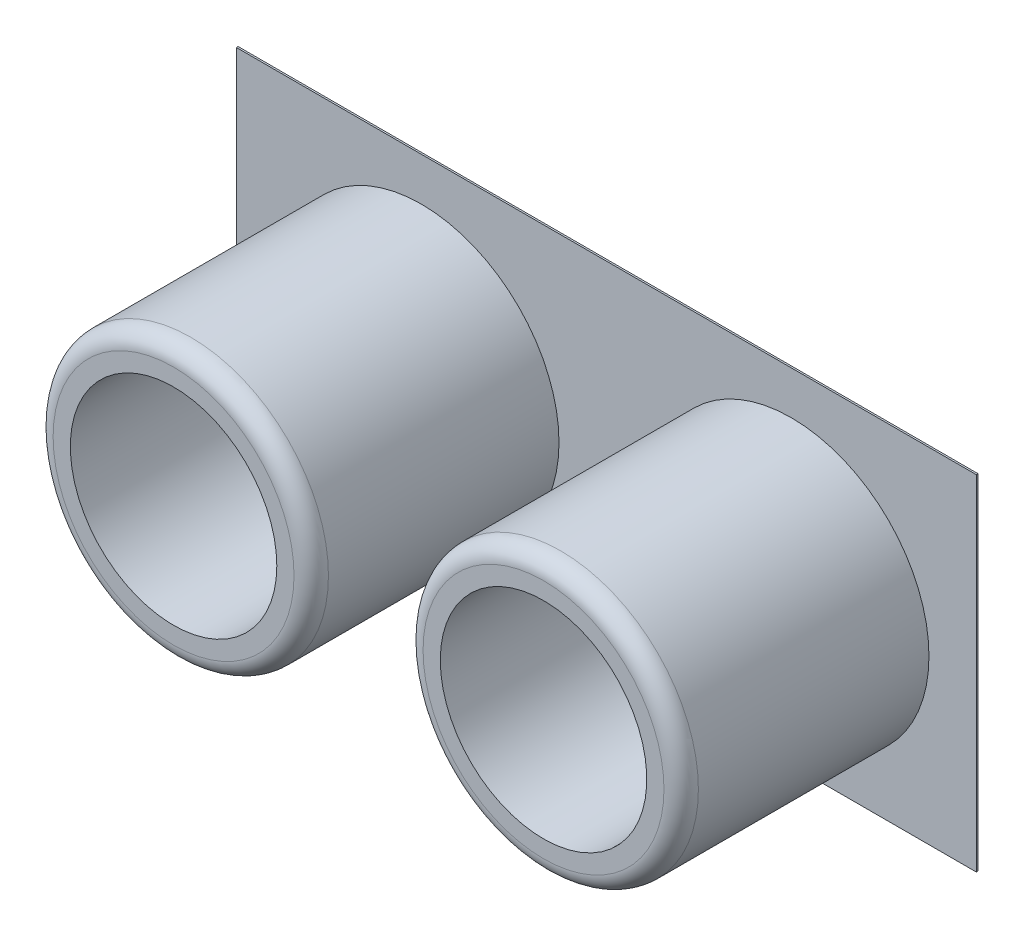
ISO-10303-21;
HEADER;
FILE_DESCRIPTION(('STEP AP214'),'2;1');
FILE_NAME('part.step','',(''),(''),'','','');
FILE_SCHEMA(('AUTOMOTIVE_DESIGN { 1 0 10303 214 1 1 1 1 }'));
ENDSEC;
DATA;
#1=APPLICATION_CONTEXT('core data for automotive mechanical design processes');
#2=APPLICATION_PROTOCOL_DEFINITION('international standard','automotive_design',2000,#1);
#3=PRODUCT_CONTEXT('',#1,'mechanical');
#4=PRODUCT('Part','Part','',(#3));
#5=PRODUCT_RELATED_PRODUCT_CATEGORY('part','',(#4));
#6=PRODUCT_DEFINITION_FORMATION('','',#4);
#7=PRODUCT_DEFINITION_CONTEXT('part definition',#1,'design');
#8=PRODUCT_DEFINITION('design','',#6,#7);
#9=PRODUCT_DEFINITION_SHAPE('','',#8);
#10=(LENGTH_UNIT() NAMED_UNIT(*) SI_UNIT(.MILLI.,.METRE.));
#11=(NAMED_UNIT(*) PLANE_ANGLE_UNIT() SI_UNIT($,.RADIAN.));
#12=(NAMED_UNIT(*) SI_UNIT($,.STERADIAN.) SOLID_ANGLE_UNIT());
#13=UNCERTAINTY_MEASURE_WITH_UNIT(LENGTH_MEASURE(1.E-05),#10,'distance_accuracy_value','');
#14=(GEOMETRIC_REPRESENTATION_CONTEXT(3) GLOBAL_UNCERTAINTY_ASSIGNED_CONTEXT((#13)) GLOBAL_UNIT_ASSIGNED_CONTEXT((#10,
#11,#12)) REPRESENTATION_CONTEXT('',''));
#15=CARTESIAN_POINT('',(0.,0.,0.));
#16=DIRECTION('',(0.,0.,1.));
#17=DIRECTION('',(1.,0.,0.));
#18=AXIS2_PLACEMENT_3D('',#15,#16,#17);
#19=CARTESIAN_POINT('',(21.5,10.5081818181818,0.1));
#20=DIRECTION('',(-1.,0.,0.));
#21=DIRECTION('',(0.,-1.,0.));
#22=AXIS2_PLACEMENT_3D('',#19,#20,#21);
#23=PLANE('',#22);
#24=DIRECTION('',(0.,1.,0.));
#25=VECTOR('',#24,1.);
#26=CARTESIAN_POINT('',(21.5,10.5081818181818,0.));
#27=LINE('',#26,#25);
#28=CARTESIAN_POINT('',(21.5,-9.49181818181818,0.));
#29=VERTEX_POINT('',#28);
#30=CARTESIAN_POINT('',(21.5,10.5081818181818,0.));
#31=VERTEX_POINT('',#30);
#32=EDGE_CURVE('E111',#29,#31,#27,.T.);
#33=ORIENTED_EDGE('',*,*,#32,.T.);
#34=DIRECTION('',(0.,0.,-1.));
#35=VECTOR('',#34,1.);
#36=CARTESIAN_POINT('',(21.5,10.5081818181818,0.1));
#37=LINE('',#36,#35);
#38=CARTESIAN_POINT('',(21.5,10.5081818181818,0.1));
#39=VERTEX_POINT('',#38);
#40=EDGE_CURVE('E99',#39,#31,#37,.T.);
#41=ORIENTED_EDGE('',*,*,#40,.F.);
#42=DIRECTION('',(0.,1.,0.));
#43=VECTOR('',#42,1.);
#44=CARTESIAN_POINT('',(21.5,10.5081818181818,0.1));
#45=LINE('',#44,#43);
#46=CARTESIAN_POINT('',(21.5,-9.49181818181818,0.1));
#47=VERTEX_POINT('',#46);
#48=EDGE_CURVE('E91',#47,#39,#45,.T.);
#49=ORIENTED_EDGE('',*,*,#48,.F.);
#50=DIRECTION('',(0.,0.,-1.));
#51=VECTOR('',#50,1.);
#52=CARTESIAN_POINT('',(21.5,-9.49181818181818,0.1));
#53=LINE('',#52,#51);
#54=EDGE_CURVE('E107',#47,#29,#53,.T.);
#55=ORIENTED_EDGE('',*,*,#54,.T.);
#56=EDGE_LOOP('',(#33,#41,#49,#55));
#57=FACE_BOUND('',#56,.T.);
#58=ADVANCED_FACE('F37',(#57),#23,.F.);
#59=CARTESIAN_POINT('',(-21.5,10.5081818181818,0.1));
#60=DIRECTION('',(0.,-1.,0.));
#61=DIRECTION('',(1.,0.,0.));
#62=AXIS2_PLACEMENT_3D('',#59,#60,#61);
#63=PLANE('',#62);
#64=DIRECTION('',(-1.,0.,0.));
#65=VECTOR('',#64,1.);
#66=CARTESIAN_POINT('',(-21.5,10.5081818181818,0.));
#67=LINE('',#66,#65);
#68=CARTESIAN_POINT('',(-21.5,10.5081818181818,0.));
#69=VERTEX_POINT('',#68);
#70=EDGE_CURVE('E97',#31,#69,#67,.T.);
#71=ORIENTED_EDGE('',*,*,#70,.T.);
#72=DIRECTION('',(0.,0.,-1.));
#73=VECTOR('',#72,1.);
#74=CARTESIAN_POINT('',(-21.5,10.5081818181818,0.1));
#75=LINE('',#74,#73);
#76=CARTESIAN_POINT('',(-21.5,10.5081818181818,0.1));
#77=VERTEX_POINT('',#76);
#78=EDGE_CURVE('E95',#77,#69,#75,.T.);
#79=ORIENTED_EDGE('',*,*,#78,.F.);
#80=DIRECTION('',(-1.,0.,0.));
#81=VECTOR('',#80,1.);
#82=CARTESIAN_POINT('',(-21.5,10.5081818181818,0.1));
#83=LINE('',#82,#81);
#84=EDGE_CURVE('E86',#39,#77,#83,.T.);
#85=ORIENTED_EDGE('',*,*,#84,.F.);
#86=ORIENTED_EDGE('',*,*,#40,.T.);
#87=EDGE_LOOP('',(#71,#79,#85,#86));
#88=FACE_BOUND('',#87,.T.);
#89=ADVANCED_FACE('F96',(#88),#63,.F.);
#90=CARTESIAN_POINT('',(-21.5,10.5081818181818,0.1));
#91=DIRECTION('',(1.,0.,0.));
#92=DIRECTION('',(0.,0.,-1.));
#93=AXIS2_PLACEMENT_3D('',#90,#91,#92);
#94=PLANE('',#93);
#95=DIRECTION('',(0.,-1.,0.));
#96=VECTOR('',#95,1.);
#97=CARTESIAN_POINT('',(-21.5,10.5081818181818,0.));
#98=LINE('',#97,#96);
#99=CARTESIAN_POINT('',(-21.5,-9.49181818181819,0.));
#100=VERTEX_POINT('',#99);
#101=EDGE_CURVE('E72',#69,#100,#98,.T.);
#102=ORIENTED_EDGE('',*,*,#101,.T.);
#103=DIRECTION('',(0.,0.,-1.));
#104=VECTOR('',#103,1.);
#105=CARTESIAN_POINT('',(-21.5,-9.49181818181819,0.1));
#106=LINE('',#105,#104);
#107=CARTESIAN_POINT('',(-21.5,-9.49181818181819,0.1));
#108=VERTEX_POINT('',#107);
#109=EDGE_CURVE('E100',#108,#100,#106,.T.);
#110=ORIENTED_EDGE('',*,*,#109,.F.);
#111=DIRECTION('',(0.,-1.,0.));
#112=VECTOR('',#111,1.);
#113=CARTESIAN_POINT('',(-21.5,10.5081818181818,0.1));
#114=LINE('',#113,#112);
#115=EDGE_CURVE('E89',#77,#108,#114,.T.);
#116=ORIENTED_EDGE('',*,*,#115,.F.);
#117=ORIENTED_EDGE('',*,*,#78,.T.);
#118=EDGE_LOOP('',(#102,#110,#116,#117));
#119=FACE_BOUND('',#118,.T.);
#120=ADVANCED_FACE('F102',(#119),#94,.F.);
#121=CARTESIAN_POINT('',(-21.5,-9.49181818181819,0.1));
#122=DIRECTION('',(0.,1.,0.));
#123=DIRECTION('',(-1.,0.,0.));
#124=AXIS2_PLACEMENT_3D('',#121,#122,#123);
#125=PLANE('',#124);
#126=DIRECTION('',(1.,0.,0.));
#127=VECTOR('',#126,1.);
#128=CARTESIAN_POINT('',(-21.5,-9.49181818181819,0.));
#129=LINE('',#128,#127);
#130=EDGE_CURVE('E78',#100,#29,#129,.T.);
#131=ORIENTED_EDGE('',*,*,#130,.T.);
#132=ORIENTED_EDGE('',*,*,#54,.F.);
#133=DIRECTION('',(1.,0.,0.));
#134=VECTOR('',#133,1.);
#135=CARTESIAN_POINT('',(-21.5,-9.49181818181819,0.1));
#136=LINE('',#135,#134);
#137=EDGE_CURVE('E55',#108,#47,#136,.T.);
#138=ORIENTED_EDGE('',*,*,#137,.F.);
#139=ORIENTED_EDGE('',*,*,#109,.T.);
#140=EDGE_LOOP('',(#131,#132,#138,#139));
#141=FACE_BOUND('',#140,.T.);
#142=ADVANCED_FACE('F164',(#141),#125,.F.);
#143=CARTESIAN_POINT('',(0.,0.,0.1));
#144=DIRECTION('',(0.,0.,1.));
#145=DIRECTION('',(1.,0.,0.));
#146=AXIS2_PLACEMENT_3D('',#143,#144,#145);
#147=PLANE('',#146);
#148=CARTESIAN_POINT('',(10.75,0.,0.1));
#149=DIRECTION('',(0.,0.,1.));
#150=DIRECTION('',(-1.,0.,0.));
#151=AXIS2_PLACEMENT_3D('',#148,#149,#150);
#152=CIRCLE('',#151,8.);
#153=CARTESIAN_POINT('',(2.75,0.,0.1));
#154=VERTEX_POINT('',#153);
#155=EDGE_CURVE('E205',#154,#154,#152,.T.);
#156=ORIENTED_EDGE('',*,*,#155,.F.);
#157=EDGE_LOOP('',(#156));
#158=FACE_BOUND('',#157,.T.);
#159=CARTESIAN_POINT('',(-10.75,0.,0.1));
#160=DIRECTION('',(0.,0.,1.));
#161=DIRECTION('',(1.,0.,0.));
#162=AXIS2_PLACEMENT_3D('',#159,#160,#161);
#163=CIRCLE('',#162,8.);
#164=CARTESIAN_POINT('',(-2.75,0.,0.1));
#165=VERTEX_POINT('',#164);
#166=EDGE_CURVE('E115',#165,#165,#163,.T.);
#167=ORIENTED_EDGE('',*,*,#166,.F.);
#168=EDGE_LOOP('',(#167));
#169=FACE_BOUND('',#168,.T.);
#170=ORIENTED_EDGE('',*,*,#48,.T.);
#171=ORIENTED_EDGE('',*,*,#84,.T.);
#172=ORIENTED_EDGE('',*,*,#115,.T.);
#173=ORIENTED_EDGE('',*,*,#137,.T.);
#174=EDGE_LOOP('',(#170,#171,#172,#173));
#175=FACE_BOUND('',#174,.T.);
#176=ADVANCED_FACE('F87',(#158,#169,#175),#147,.T.);
#177=CARTESIAN_POINT('',(0.,0.,0.));
#178=DIRECTION('',(0.,0.,1.));
#179=DIRECTION('',(1.,0.,0.));
#180=AXIS2_PLACEMENT_3D('',#177,#178,#179);
#181=PLANE('',#180);
#182=ORIENTED_EDGE('',*,*,#32,.F.);
#183=ORIENTED_EDGE('',*,*,#130,.F.);
#184=ORIENTED_EDGE('',*,*,#101,.F.);
#185=ORIENTED_EDGE('',*,*,#70,.F.);
#186=EDGE_LOOP('',(#182,#183,#184,#185));
#187=FACE_BOUND('',#186,.T.);
#188=ADVANCED_FACE('F167',(#187),#181,.F.);
#189=CARTESIAN_POINT('',(-10.75,0.,14.5));
#190=DIRECTION('',(0.,0.,-1.));
#191=DIRECTION('',(-1.,0.,0.));
#192=AXIS2_PLACEMENT_3D('',#189,#190,#191);
#193=CYLINDRICAL_SURFACE('',#192,8.);
#194=CARTESIAN_POINT('',(-10.75,0.,13.5));
#195=DIRECTION('',(0.,0.,1.));
#196=DIRECTION('',(1.,0.,0.));
#197=AXIS2_PLACEMENT_3D('',#194,#195,#196);
#198=CIRCLE('',#197,8.);
#199=CARTESIAN_POINT('',(-2.75,0.,13.5));
#200=VERTEX_POINT('',#199);
#201=EDGE_CURVE('E131',#200,#200,#198,.F.);
#202=ORIENTED_EDGE('',*,*,#201,.T.);
#203=EDGE_LOOP('',(#202));
#204=FACE_BOUND('',#203,.T.);
#205=ORIENTED_EDGE('',*,*,#166,.T.);
#206=EDGE_LOOP('',(#205));
#207=FACE_BOUND('',#206,.T.);
#208=ADVANCED_FACE('F170',(#204,#207),#193,.T.);
#209=CARTESIAN_POINT('',(-10.75,0.,14.5));
#210=DIRECTION('',(0.,0.,1.));
#211=DIRECTION('',(1.,0.,0.));
#212=AXIS2_PLACEMENT_3D('',#209,#210,#211);
#213=PLANE('',#212);
#214=CARTESIAN_POINT('',(-10.75,0.,14.5));
#215=DIRECTION('',(0.,0.,1.));
#216=DIRECTION('',(1.,0.,0.));
#217=AXIS2_PLACEMENT_3D('',#214,#215,#216);
#218=CIRCLE('',#217,6.);
#219=CARTESIAN_POINT('',(-4.75,0.,14.5));
#220=VERTEX_POINT('',#219);
#221=EDGE_CURVE('E206',#220,#220,#218,.T.);
#222=ORIENTED_EDGE('',*,*,#221,.F.);
#223=EDGE_LOOP('',(#222));
#224=FACE_BOUND('',#223,.T.);
#225=CARTESIAN_POINT('',(-10.75,0.,14.5));
#226=DIRECTION('',(0.,0.,1.));
#227=DIRECTION('',(1.,0.,0.));
#228=AXIS2_PLACEMENT_3D('',#225,#226,#227);
#229=CIRCLE('',#228,7.);
#230=CARTESIAN_POINT('',(-3.75,0.,14.5));
#231=VERTEX_POINT('',#230);
#232=EDGE_CURVE('E127',#231,#231,#229,.T.);
#233=ORIENTED_EDGE('',*,*,#232,.T.);
#234=EDGE_LOOP('',(#233));
#235=FACE_BOUND('',#234,.T.);
#236=ADVANCED_FACE('F177',(#224,#235),#213,.T.);
#237=CARTESIAN_POINT('',(10.75,0.,14.5));
#238=DIRECTION('',(0.,0.,-1.));
#239=DIRECTION('',(-1.,0.,0.));
#240=AXIS2_PLACEMENT_3D('',#237,#238,#239);
#241=CYLINDRICAL_SURFACE('',#240,8.);
#242=CARTESIAN_POINT('',(10.75,0.,13.5));
#243=DIRECTION('',(0.,0.,-1.));
#244=DIRECTION('',(-1.,0.,0.));
#245=AXIS2_PLACEMENT_3D('',#242,#243,#244);
#246=CIRCLE('',#245,8.);
#247=CARTESIAN_POINT('',(2.75,0.,13.5));
#248=VERTEX_POINT('',#247);
#249=EDGE_CURVE('E11',#248,#248,#246,.T.);
#250=ORIENTED_EDGE('',*,*,#249,.T.);
#251=EDGE_LOOP('',(#250));
#252=FACE_BOUND('',#251,.T.);
#253=ORIENTED_EDGE('',*,*,#155,.T.);
#254=EDGE_LOOP('',(#253));
#255=FACE_BOUND('',#254,.T.);
#256=ADVANCED_FACE('F181',(#252,#255),#241,.T.);
#257=CARTESIAN_POINT('',(10.75,0.,14.5));
#258=DIRECTION('',(0.,0.,-1.));
#259=DIRECTION('',(-1.,0.,0.));
#260=AXIS2_PLACEMENT_3D('',#257,#258,#259);
#261=PLANE('',#260);
#262=CARTESIAN_POINT('',(10.75,0.,14.5));
#263=DIRECTION('',(0.,0.,1.));
#264=DIRECTION('',(-1.,0.,0.));
#265=AXIS2_PLACEMENT_3D('',#262,#263,#264);
#266=CIRCLE('',#265,6.);
#267=CARTESIAN_POINT('',(4.75,0.,14.5));
#268=VERTEX_POINT('',#267);
#269=EDGE_CURVE('E219',#268,#268,#266,.T.);
#270=ORIENTED_EDGE('',*,*,#269,.F.);
#271=EDGE_LOOP('',(#270));
#272=FACE_BOUND('',#271,.T.);
#273=CARTESIAN_POINT('',(10.75,0.,14.5));
#274=DIRECTION('',(0.,0.,-1.));
#275=DIRECTION('',(-1.,0.,0.));
#276=AXIS2_PLACEMENT_3D('',#273,#274,#275);
#277=CIRCLE('',#276,7.);
#278=CARTESIAN_POINT('',(3.75,0.,14.5));
#279=VERTEX_POINT('',#278);
#280=EDGE_CURVE('E47',#279,#279,#277,.F.);
#281=ORIENTED_EDGE('',*,*,#280,.T.);
#282=EDGE_LOOP('',(#281));
#283=FACE_BOUND('',#282,.T.);
#284=ADVANCED_FACE('F139',(#272,#283),#261,.F.);
#285=CARTESIAN_POINT('',(-10.75,0.,13.5));
#286=DIRECTION('',(0.,0.,1.));
#287=DIRECTION('',(1.,0.,0.));
#288=AXIS2_PLACEMENT_3D('',#285,#286,#287);
#289=TOROIDAL_SURFACE('',#288,7.,1.);
#290=ORIENTED_EDGE('',*,*,#201,.F.);
#291=EDGE_LOOP('',(#290));
#292=FACE_BOUND('',#291,.T.);
#293=ORIENTED_EDGE('',*,*,#232,.F.);
#294=EDGE_LOOP('',(#293));
#295=FACE_BOUND('',#294,.T.);
#296=ADVANCED_FACE('F143',(#292,#295),#289,.T.);
#297=CARTESIAN_POINT('',(10.75,0.,13.5));
#298=DIRECTION('',(0.,0.,-1.));
#299=DIRECTION('',(-1.,0.,0.));
#300=AXIS2_PLACEMENT_3D('',#297,#298,#299);
#301=TOROIDAL_SURFACE('',#300,7.,1.);
#302=ORIENTED_EDGE('',*,*,#249,.F.);
#303=EDGE_LOOP('',(#302));
#304=FACE_BOUND('',#303,.T.);
#305=ORIENTED_EDGE('',*,*,#280,.F.);
#306=EDGE_LOOP('',(#305));
#307=FACE_BOUND('',#306,.T.);
#308=ADVANCED_FACE('F39',(#304,#307),#301,.T.);
#309=CARTESIAN_POINT('',(10.75,0.,4.5));
#310=DIRECTION('',(0.,0.,1.));
#311=DIRECTION('',(1.,0.,0.));
#312=AXIS2_PLACEMENT_3D('',#309,#310,#311);
#313=CYLINDRICAL_SURFACE('',#312,6.);
#314=CARTESIAN_POINT('',(10.75,0.,4.5));
#315=DIRECTION('',(0.,0.,1.));
#316=DIRECTION('',(-1.,0.,0.));
#317=AXIS2_PLACEMENT_3D('',#314,#315,#316);
#318=CIRCLE('',#317,6.);
#319=CARTESIAN_POINT('',(4.75,0.,4.5));
#320=VERTEX_POINT('',#319);
#321=EDGE_CURVE('E213',#320,#320,#318,.T.);
#322=ORIENTED_EDGE('',*,*,#321,.F.);
#323=EDGE_LOOP('',(#322));
#324=FACE_BOUND('',#323,.T.);
#325=ORIENTED_EDGE('',*,*,#269,.T.);
#326=EDGE_LOOP('',(#325));
#327=FACE_BOUND('',#326,.T.);
#328=ADVANCED_FACE('F142',(#324,#327),#313,.F.);
#329=CARTESIAN_POINT('',(10.75,0.,4.5));
#330=DIRECTION('',(0.,0.,-1.));
#331=DIRECTION('',(-1.,0.,0.));
#332=AXIS2_PLACEMENT_3D('',#329,#330,#331);
#333=PLANE('',#332);
#334=ORIENTED_EDGE('',*,*,#321,.T.);
#335=EDGE_LOOP('',(#334));
#336=FACE_BOUND('',#335,.T.);
#337=ADVANCED_FACE('F149',(#336),#333,.F.);
#338=CARTESIAN_POINT('',(-10.75,0.,4.5));
#339=DIRECTION('',(0.,0.,1.));
#340=DIRECTION('',(1.,0.,0.));
#341=AXIS2_PLACEMENT_3D('',#338,#339,#340);
#342=CYLINDRICAL_SURFACE('',#341,6.);
#343=CARTESIAN_POINT('',(-10.75,0.,4.5));
#344=DIRECTION('',(0.,0.,1.));
#345=DIRECTION('',(1.,0.,0.));
#346=AXIS2_PLACEMENT_3D('',#343,#344,#345);
#347=CIRCLE('',#346,6.);
#348=CARTESIAN_POINT('',(-4.75,0.,4.5));
#349=VERTEX_POINT('',#348);
#350=EDGE_CURVE('E203',#349,#349,#347,.T.);
#351=ORIENTED_EDGE('',*,*,#350,.F.);
#352=EDGE_LOOP('',(#351));
#353=FACE_BOUND('',#352,.T.);
#354=ORIENTED_EDGE('',*,*,#221,.T.);
#355=EDGE_LOOP('',(#354));
#356=FACE_BOUND('',#355,.T.);
#357=ADVANCED_FACE('F191',(#353,#356),#342,.F.);
#358=CARTESIAN_POINT('',(-10.75,0.,4.5));
#359=DIRECTION('',(0.,0.,1.));
#360=DIRECTION('',(1.,0.,0.));
#361=AXIS2_PLACEMENT_3D('',#358,#359,#360);
#362=PLANE('',#361);
#363=ORIENTED_EDGE('',*,*,#350,.T.);
#364=EDGE_LOOP('',(#363));
#365=FACE_BOUND('',#364,.T.);
#366=ADVANCED_FACE('F195',(#365),#362,.T.);
#367=CLOSED_SHELL('',(#58,#89,#120,#142,#176,#188,#208,#236,#256,#284,#296,#308,#328,#337,#357,#366));
#368=MANIFOLD_SOLID_BREP('B2',#367);
#369=ADVANCED_BREP_SHAPE_REPRESENTATION('',(#18,#368),#14);
#370=SHAPE_DEFINITION_REPRESENTATION(#9,#369);
ENDSEC;
END-ISO-10303-21;
